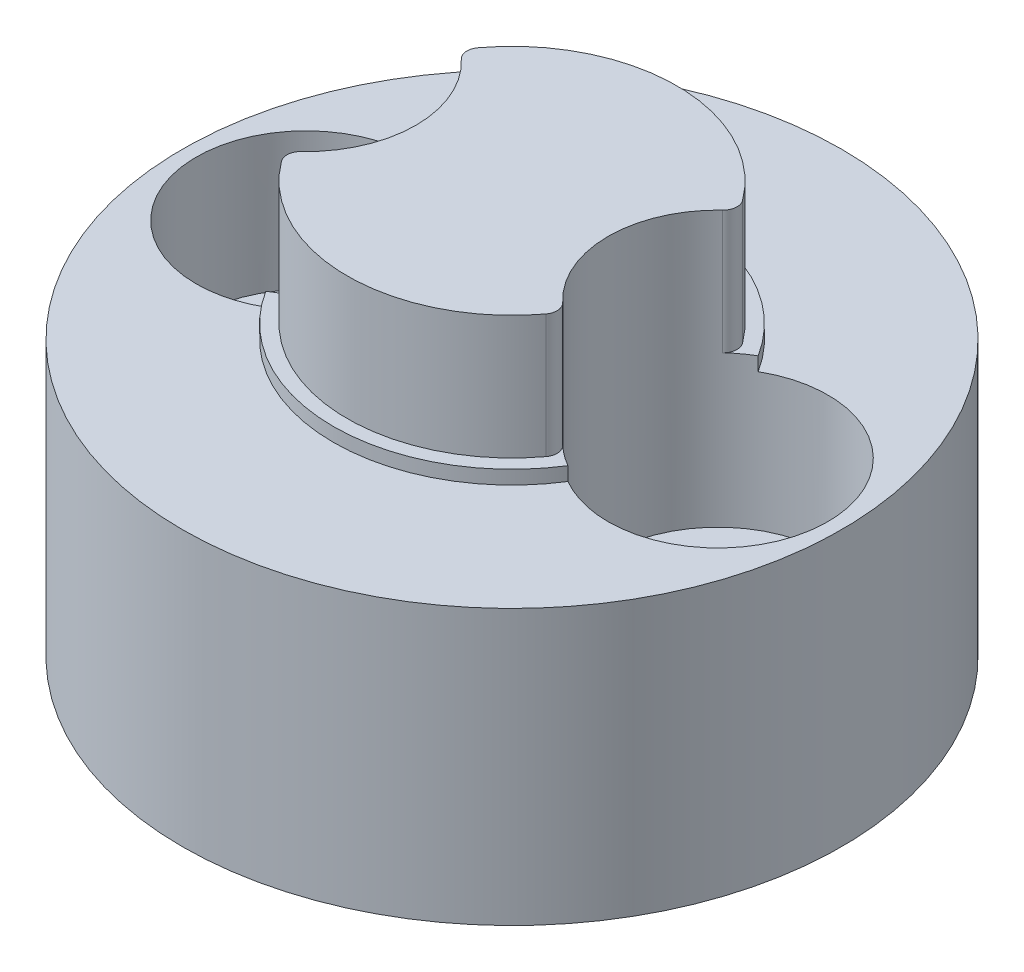
ISO-10303-21;
HEADER;
FILE_DESCRIPTION(('STEP AP214'),'2;1');
FILE_NAME('part.step','',(''),(''),'','','');
FILE_SCHEMA(('AUTOMOTIVE_DESIGN { 1 0 10303 214 1 1 1 1 }'));
ENDSEC;
DATA;
#1=APPLICATION_CONTEXT('core data for automotive mechanical design processes');
#2=APPLICATION_PROTOCOL_DEFINITION('international standard','automotive_design',2000,#1);
#3=PRODUCT_CONTEXT('',#1,'mechanical');
#4=PRODUCT('Part','Part','',(#3));
#5=PRODUCT_RELATED_PRODUCT_CATEGORY('part','',(#4));
#6=PRODUCT_DEFINITION_FORMATION('','',#4);
#7=PRODUCT_DEFINITION_CONTEXT('part definition',#1,'design');
#8=PRODUCT_DEFINITION('design','',#6,#7);
#9=PRODUCT_DEFINITION_SHAPE('','',#8);
#10=(LENGTH_UNIT() NAMED_UNIT(*) SI_UNIT(.MILLI.,.METRE.));
#11=(NAMED_UNIT(*) PLANE_ANGLE_UNIT() SI_UNIT($,.RADIAN.));
#12=(NAMED_UNIT(*) SI_UNIT($,.STERADIAN.) SOLID_ANGLE_UNIT());
#13=UNCERTAINTY_MEASURE_WITH_UNIT(LENGTH_MEASURE(1.E-05),#10,'distance_accuracy_value','');
#14=(GEOMETRIC_REPRESENTATION_CONTEXT(3) GLOBAL_UNCERTAINTY_ASSIGNED_CONTEXT((#13)) GLOBAL_UNIT_ASSIGNED_CONTEXT((#10,
#11,#12)) REPRESENTATION_CONTEXT('',''));
#15=CARTESIAN_POINT('',(0.,0.,0.));
#16=DIRECTION('',(0.,0.,1.));
#17=DIRECTION('',(1.,0.,0.));
#18=AXIS2_PLACEMENT_3D('',#15,#16,#17);
#19=CARTESIAN_POINT('',(-7.5,15.,0.));
#20=DIRECTION('',(0.,-1.,0.));
#21=DIRECTION('',(0.,0.,-1.));
#22=AXIS2_PLACEMENT_3D('',#19,#20,#21);
#23=CYLINDRICAL_SURFACE('',#22,2.15);
#24=CARTESIAN_POINT('',(-7.5,0.,0.));
#25=DIRECTION('',(0.,1.,0.));
#26=DIRECTION('',(0.,0.,1.));
#27=AXIS2_PLACEMENT_3D('',#24,#25,#26);
#28=CIRCLE('',#27,2.15);
#29=CARTESIAN_POINT('',(-7.5,0.,2.15));
#30=VERTEX_POINT('',#29);
#31=EDGE_CURVE('E170',#30,#30,#28,.T.);
#32=ORIENTED_EDGE('',*,*,#31,.F.);
#33=EDGE_LOOP('',(#32));
#34=FACE_BOUND('',#33,.T.);
#35=CARTESIAN_POINT('',(-7.5,5.,0.));
#36=DIRECTION('',(0.,1.,0.));
#37=DIRECTION('',(0.,0.,1.));
#38=AXIS2_PLACEMENT_3D('',#35,#36,#37);
#39=CIRCLE('',#38,2.15);
#40=CARTESIAN_POINT('',(-7.5,5.,2.15));
#41=VERTEX_POINT('',#40);
#42=EDGE_CURVE('E155',#41,#41,#39,.T.);
#43=ORIENTED_EDGE('',*,*,#42,.T.);
#44=EDGE_LOOP('',(#43));
#45=FACE_BOUND('',#44,.T.);
#46=ADVANCED_FACE('F33',(#34,#45),#23,.F.);
#47=CARTESIAN_POINT('',(7.5,15.,0.));
#48=DIRECTION('',(0.,-1.,0.));
#49=DIRECTION('',(0.,0.,-1.));
#50=AXIS2_PLACEMENT_3D('',#47,#48,#49);
#51=CYLINDRICAL_SURFACE('',#50,2.15);
#52=CARTESIAN_POINT('',(7.5,0.,0.));
#53=DIRECTION('',(0.,1.,0.));
#54=DIRECTION('',(0.,0.,-1.));
#55=AXIS2_PLACEMENT_3D('',#52,#53,#54);
#56=CIRCLE('',#55,2.15);
#57=CARTESIAN_POINT('',(7.5,0.,-2.15));
#58=VERTEX_POINT('',#57);
#59=EDGE_CURVE('E167',#58,#58,#56,.T.);
#60=ORIENTED_EDGE('',*,*,#59,.F.);
#61=EDGE_LOOP('',(#60));
#62=FACE_BOUND('',#61,.T.);
#63=CARTESIAN_POINT('',(7.5,5.,0.));
#64=DIRECTION('',(0.,1.,0.));
#65=DIRECTION('',(0.,0.,1.));
#66=AXIS2_PLACEMENT_3D('',#63,#64,#65);
#67=CIRCLE('',#66,2.15);
#68=CARTESIAN_POINT('',(7.5,5.,2.15));
#69=VERTEX_POINT('',#68);
#70=EDGE_CURVE('E180',#69,#69,#67,.T.);
#71=ORIENTED_EDGE('',*,*,#70,.T.);
#72=EDGE_LOOP('',(#71));
#73=FACE_BOUND('',#72,.T.);
#74=ADVANCED_FACE('F290',(#62,#73),#51,.F.);
#75=CARTESIAN_POINT('',(0.,15.,0.));
#76=DIRECTION('',(0.,1.,0.));
#77=DIRECTION('',(0.,0.,1.));
#78=AXIS2_PLACEMENT_3D('',#75,#76,#77);
#79=PLANE('',#78);
#80=CARTESIAN_POINT('',(0.,15.,0.));
#81=DIRECTION('',(0.,1.,0.));
#82=DIRECTION('',(0.,0.,1.));
#83=AXIS2_PLACEMENT_3D('',#80,#81,#82);
#84=CIRCLE('',#83,6.);
#85=CARTESIAN_POINT('',(4.81818181818182,15.,-3.5756291707813));
#86=VERTEX_POINT('',#85);
#87=CARTESIAN_POINT('',(-4.81818181818182,15.,-3.5756291707813));
#88=VERTEX_POINT('',#87);
#89=EDGE_CURVE('E161',#86,#88,#84,.T.);
#90=ORIENTED_EDGE('',*,*,#89,.T.);
#91=CARTESIAN_POINT('',(-4.41666666666667,15.,-3.27766007321619));
#92=DIRECTION('',(0.,1.,0.));
#93=DIRECTION('',(0.,0.,1.));
#94=AXIS2_PLACEMENT_3D('',#91,#92,#93);
#95=CIRCLE('',#94,0.5);
#96=CARTESIAN_POINT('',(-4.75925925925926,15.,-2.91347562063661));
#97=VERTEX_POINT('',#96);
#98=EDGE_CURVE('E200',#88,#97,#95,.T.);
#99=ORIENTED_EDGE('',*,*,#98,.T.);
#100=CARTESIAN_POINT('',(-7.5,15.,0.));
#101=DIRECTION('',(0.,1.,0.));
#102=DIRECTION('',(0.,0.,1.));
#103=AXIS2_PLACEMENT_3D('',#100,#101,#102);
#104=CIRCLE('',#103,4.);
#105=CARTESIAN_POINT('',(-4.75925925925926,15.,2.91347562063661));
#106=VERTEX_POINT('',#105);
#107=EDGE_CURVE('E229',#106,#97,#104,.T.);
#108=ORIENTED_EDGE('',*,*,#107,.F.);
#109=CARTESIAN_POINT('',(-4.41666666666667,15.,3.27766007321619));
#110=DIRECTION('',(0.,1.,0.));
#111=DIRECTION('',(0.,0.,1.));
#112=AXIS2_PLACEMENT_3D('',#109,#110,#111);
#113=CIRCLE('',#112,0.5);
#114=CARTESIAN_POINT('',(-4.81818181818182,15.,3.5756291707813));
#115=VERTEX_POINT('',#114);
#116=EDGE_CURVE('E198',#106,#115,#113,.T.);
#117=ORIENTED_EDGE('',*,*,#116,.T.);
#118=CARTESIAN_POINT('',(0.,15.,0.));
#119=DIRECTION('',(0.,1.,0.));
#120=DIRECTION('',(0.,0.,1.));
#121=AXIS2_PLACEMENT_3D('',#118,#119,#120);
#122=CIRCLE('',#121,6.);
#123=CARTESIAN_POINT('',(4.81818181818182,15.,3.5756291707813));
#124=VERTEX_POINT('',#123);
#125=EDGE_CURVE('E158',#115,#124,#122,.T.);
#126=ORIENTED_EDGE('',*,*,#125,.T.);
#127=CARTESIAN_POINT('',(4.41666666666667,15.,3.27766007321619));
#128=DIRECTION('',(0.,1.,0.));
#129=DIRECTION('',(0.,0.,1.));
#130=AXIS2_PLACEMENT_3D('',#127,#128,#129);
#131=CIRCLE('',#130,0.5);
#132=CARTESIAN_POINT('',(4.75925925925926,15.,2.91347562063661));
#133=VERTEX_POINT('',#132);
#134=EDGE_CURVE('E194',#124,#133,#131,.T.);
#135=ORIENTED_EDGE('',*,*,#134,.T.);
#136=CARTESIAN_POINT('',(7.5,15.,0.));
#137=DIRECTION('',(0.,1.,0.));
#138=DIRECTION('',(0.,0.,1.));
#139=AXIS2_PLACEMENT_3D('',#136,#137,#138);
#140=CIRCLE('',#139,4.);
#141=CARTESIAN_POINT('',(4.75925925925926,15.,-2.91347562063661));
#142=VERTEX_POINT('',#141);
#143=EDGE_CURVE('E240',#142,#133,#140,.T.);
#144=ORIENTED_EDGE('',*,*,#143,.F.);
#145=CARTESIAN_POINT('',(4.41666666666667,15.,-3.27766007321619));
#146=DIRECTION('',(0.,1.,0.));
#147=DIRECTION('',(0.,0.,1.));
#148=AXIS2_PLACEMENT_3D('',#145,#146,#147);
#149=CIRCLE('',#148,0.5);
#150=EDGE_CURVE('E196',#142,#86,#149,.T.);
#151=ORIENTED_EDGE('',*,*,#150,.T.);
#152=EDGE_LOOP('',(#90,#99,#108,#117,#126,#135,#144,#151));
#153=FACE_BOUND('',#152,.T.);
#154=ADVANCED_FACE('F232',(#153),#79,.T.);
#155=CARTESIAN_POINT('',(0.,15.,0.));
#156=DIRECTION('',(0.,-1.,0.));
#157=DIRECTION('',(0.,0.,-1.));
#158=AXIS2_PLACEMENT_3D('',#155,#156,#157);
#159=CYLINDRICAL_SURFACE('',#158,12.);
#160=CARTESIAN_POINT('',(0.,0.,0.));
#161=DIRECTION('',(0.,1.,0.));
#162=DIRECTION('',(0.,0.,1.));
#163=AXIS2_PLACEMENT_3D('',#160,#161,#162);
#164=CIRCLE('',#163,12.);
#165=CARTESIAN_POINT('',(0.,0.,12.));
#166=VERTEX_POINT('',#165);
#167=EDGE_CURVE('E173',#166,#166,#164,.T.);
#168=ORIENTED_EDGE('',*,*,#167,.T.);
#169=EDGE_LOOP('',(#168));
#170=FACE_BOUND('',#169,.T.);
#171=CARTESIAN_POINT('',(0.,10.,0.));
#172=DIRECTION('',(0.,1.,0.));
#173=DIRECTION('',(0.,0.,1.));
#174=AXIS2_PLACEMENT_3D('',#171,#172,#173);
#175=CIRCLE('',#174,12.);
#176=CARTESIAN_POINT('',(0.,10.,12.));
#177=VERTEX_POINT('',#176);
#178=EDGE_CURVE('E164',#177,#177,#175,.T.);
#179=ORIENTED_EDGE('',*,*,#178,.F.);
#180=EDGE_LOOP('',(#179));
#181=FACE_BOUND('',#180,.T.);
#182=ADVANCED_FACE('F303',(#170,#181),#159,.T.);
#183=CARTESIAN_POINT('',(0.,0.,0.));
#184=DIRECTION('',(0.,1.,0.));
#185=DIRECTION('',(0.,0.,1.));
#186=AXIS2_PLACEMENT_3D('',#183,#184,#185);
#187=PLANE('',#186);
#188=ORIENTED_EDGE('',*,*,#167,.F.);
#189=EDGE_LOOP('',(#188));
#190=FACE_BOUND('',#189,.T.);
#191=ORIENTED_EDGE('',*,*,#31,.T.);
#192=EDGE_LOOP('',(#191));
#193=FACE_BOUND('',#192,.T.);
#194=ORIENTED_EDGE('',*,*,#59,.T.);
#195=EDGE_LOOP('',(#194));
#196=FACE_BOUND('',#195,.T.);
#197=ADVANCED_FACE('F304',(#190,#193,#196),#187,.F.);
#198=CARTESIAN_POINT('',(0.,10.,0.));
#199=DIRECTION('',(0.,1.,0.));
#200=DIRECTION('',(0.,0.,1.));
#201=AXIS2_PLACEMENT_3D('',#198,#199,#200);
#202=PLANE('',#201);
#203=CARTESIAN_POINT('',(-7.5,10.,0.));
#204=DIRECTION('',(0.,1.,0.));
#205=DIRECTION('',(0.,0.,1.));
#206=AXIS2_PLACEMENT_3D('',#203,#204,#205);
#207=CIRCLE('',#206,4.);
#208=CARTESIAN_POINT('',(-5.5,10.,-3.46410161513776));
#209=VERTEX_POINT('',#208);
#210=CARTESIAN_POINT('',(-5.5,10.,3.46410161513776));
#211=VERTEX_POINT('',#210);
#212=EDGE_CURVE('E252',#209,#211,#207,.T.);
#213=ORIENTED_EDGE('',*,*,#212,.F.);
#214=CARTESIAN_POINT('',(0.,10.,0.));
#215=DIRECTION('',(0.,1.,0.));
#216=DIRECTION('',(0.,0.,1.));
#217=AXIS2_PLACEMENT_3D('',#214,#215,#216);
#218=CIRCLE('',#217,6.5);
#219=CARTESIAN_POINT('',(5.5,10.,-3.46410161513776));
#220=VERTEX_POINT('',#219);
#221=EDGE_CURVE('E149',#220,#209,#218,.T.);
#222=ORIENTED_EDGE('',*,*,#221,.F.);
#223=CARTESIAN_POINT('',(7.5,10.,0.));
#224=DIRECTION('',(0.,1.,0.));
#225=DIRECTION('',(0.,0.,1.));
#226=AXIS2_PLACEMENT_3D('',#223,#224,#225);
#227=CIRCLE('',#226,4.);
#228=CARTESIAN_POINT('',(5.5,10.,3.46410161513776));
#229=VERTEX_POINT('',#228);
#230=EDGE_CURVE('E124',#229,#220,#227,.T.);
#231=ORIENTED_EDGE('',*,*,#230,.F.);
#232=CARTESIAN_POINT('',(0.,10.,0.));
#233=DIRECTION('',(0.,1.,0.));
#234=DIRECTION('',(0.,0.,1.));
#235=AXIS2_PLACEMENT_3D('',#232,#233,#234);
#236=CIRCLE('',#235,6.5);
#237=EDGE_CURVE('E144',#211,#229,#236,.T.);
#238=ORIENTED_EDGE('',*,*,#237,.F.);
#239=EDGE_LOOP('',(#213,#222,#231,#238));
#240=FACE_BOUND('',#239,.T.);
#241=ORIENTED_EDGE('',*,*,#178,.T.);
#242=EDGE_LOOP('',(#241));
#243=FACE_BOUND('',#242,.T.);
#244=ADVANCED_FACE('F260',(#240,#243),#202,.T.);
#245=CARTESIAN_POINT('',(0.,10.,0.));
#246=DIRECTION('',(0.,1.,0.));
#247=DIRECTION('',(0.,0.,1.));
#248=AXIS2_PLACEMENT_3D('',#245,#246,#247);
#249=CYLINDRICAL_SURFACE('',#248,6.);
#250=CARTESIAN_POINT('',(0.,10.5,0.));
#251=DIRECTION('',(0.,1.,0.));
#252=DIRECTION('',(0.,0.,1.));
#253=AXIS2_PLACEMENT_3D('',#250,#251,#252);
#254=CIRCLE('',#253,6.);
#255=CARTESIAN_POINT('',(-4.81818181818182,10.5,-3.5756291707813));
#256=VERTEX_POINT('',#255);
#257=CARTESIAN_POINT('',(4.81818181818182,10.5,-3.5756291707813));
#258=VERTEX_POINT('',#257);
#259=EDGE_CURVE('E146',#256,#258,#254,.F.);
#260=ORIENTED_EDGE('',*,*,#259,.F.);
#261=DIRECTION('',(0.,1.,0.));
#262=VECTOR('',#261,1.);
#263=CARTESIAN_POINT('',(-4.81818181818182,10.,-3.5756291707813));
#264=LINE('',#263,#262);
#265=EDGE_CURVE('E192',#256,#88,#264,.T.);
#266=ORIENTED_EDGE('',*,*,#265,.T.);
#267=ORIENTED_EDGE('',*,*,#89,.F.);
#268=DIRECTION('',(0.,1.,0.));
#269=VECTOR('',#268,1.);
#270=CARTESIAN_POINT('',(4.81818181818182,10.,-3.5756291707813));
#271=LINE('',#270,#269);
#272=EDGE_CURVE('E190',#86,#258,#271,.F.);
#273=ORIENTED_EDGE('',*,*,#272,.T.);
#274=EDGE_LOOP('',(#260,#266,#267,#273));
#275=FACE_BOUND('',#274,.T.);
#276=ADVANCED_FACE('F269',(#275),#249,.T.);
#277=CARTESIAN_POINT('',(0.,10.,0.));
#278=DIRECTION('',(0.,1.,0.));
#279=DIRECTION('',(0.,0.,1.));
#280=AXIS2_PLACEMENT_3D('',#277,#278,#279);
#281=CYLINDRICAL_SURFACE('',#280,6.);
#282=ORIENTED_EDGE('',*,*,#125,.F.);
#283=DIRECTION('',(0.,1.,0.));
#284=VECTOR('',#283,1.);
#285=CARTESIAN_POINT('',(-4.81818181818182,10.,3.5756291707813));
#286=LINE('',#285,#284);
#287=CARTESIAN_POINT('',(-4.81818181818182,10.5,3.5756291707813));
#288=VERTEX_POINT('',#287);
#289=EDGE_CURVE('E204',#115,#288,#286,.F.);
#290=ORIENTED_EDGE('',*,*,#289,.T.);
#291=CARTESIAN_POINT('',(0.,10.5,0.));
#292=DIRECTION('',(0.,1.,0.));
#293=DIRECTION('',(0.,0.,1.));
#294=AXIS2_PLACEMENT_3D('',#291,#292,#293);
#295=CIRCLE('',#294,6.);
#296=CARTESIAN_POINT('',(4.81818181818182,10.5,3.5756291707813));
#297=VERTEX_POINT('',#296);
#298=EDGE_CURVE('E130',#297,#288,#295,.F.);
#299=ORIENTED_EDGE('',*,*,#298,.F.);
#300=DIRECTION('',(0.,1.,0.));
#301=VECTOR('',#300,1.);
#302=CARTESIAN_POINT('',(4.81818181818182,10.,3.5756291707813));
#303=LINE('',#302,#301);
#304=EDGE_CURVE('E202',#297,#124,#303,.T.);
#305=ORIENTED_EDGE('',*,*,#304,.T.);
#306=EDGE_LOOP('',(#282,#290,#299,#305));
#307=FACE_BOUND('',#306,.T.);
#308=ADVANCED_FACE('F279',(#307),#281,.T.);
#309=CARTESIAN_POINT('',(3.75,10.5,0.));
#310=DIRECTION('',(0.,1.,0.));
#311=DIRECTION('',(0.,0.,1.));
#312=AXIS2_PLACEMENT_3D('',#309,#310,#311);
#313=PLANE('',#312);
#314=CARTESIAN_POINT('',(-7.5,10.5,0.));
#315=DIRECTION('',(0.,1.,0.));
#316=DIRECTION('',(0.,0.,1.));
#317=AXIS2_PLACEMENT_3D('',#314,#315,#316);
#318=CIRCLE('',#317,4.);
#319=CARTESIAN_POINT('',(-5.5,10.5,3.46410161513776));
#320=VERTEX_POINT('',#319);
#321=CARTESIAN_POINT('',(-4.75925925925926,10.5,2.91347562063661));
#322=VERTEX_POINT('',#321);
#323=EDGE_CURVE('E152',#320,#322,#318,.T.);
#324=ORIENTED_EDGE('',*,*,#323,.F.);
#325=CARTESIAN_POINT('',(0.,10.5,0.));
#326=DIRECTION('',(0.,1.,0.));
#327=DIRECTION('',(0.,0.,1.));
#328=AXIS2_PLACEMENT_3D('',#325,#326,#327);
#329=CIRCLE('',#328,6.5);
#330=CARTESIAN_POINT('',(5.5,10.5,3.46410161513776));
#331=VERTEX_POINT('',#330);
#332=EDGE_CURVE('E143',#320,#331,#329,.T.);
#333=ORIENTED_EDGE('',*,*,#332,.T.);
#334=CARTESIAN_POINT('',(7.5,10.5,0.));
#335=DIRECTION('',(0.,1.,0.));
#336=DIRECTION('',(0.,0.,1.));
#337=AXIS2_PLACEMENT_3D('',#334,#335,#336);
#338=CIRCLE('',#337,4.);
#339=CARTESIAN_POINT('',(4.75925925925926,10.5,2.91347562063661));
#340=VERTEX_POINT('',#339);
#341=EDGE_CURVE('E55',#340,#331,#338,.T.);
#342=ORIENTED_EDGE('',*,*,#341,.F.);
#343=CARTESIAN_POINT('',(4.41666666666667,10.5,3.27766007321619));
#344=DIRECTION('',(0.,1.,0.));
#345=DIRECTION('',(0.,0.,1.));
#346=AXIS2_PLACEMENT_3D('',#343,#344,#345);
#347=CIRCLE('',#346,0.5);
#348=EDGE_CURVE('E11',#340,#297,#347,.F.);
#349=ORIENTED_EDGE('',*,*,#348,.T.);
#350=ORIENTED_EDGE('',*,*,#298,.T.);
#351=CARTESIAN_POINT('',(-4.41666666666667,10.5,3.27766007321619));
#352=DIRECTION('',(0.,1.,0.));
#353=DIRECTION('',(0.,0.,1.));
#354=AXIS2_PLACEMENT_3D('',#351,#352,#353);
#355=CIRCLE('',#354,0.5);
#356=EDGE_CURVE('E213',#288,#322,#355,.F.);
#357=ORIENTED_EDGE('',*,*,#356,.T.);
#358=EDGE_LOOP('',(#324,#333,#342,#349,#350,#357));
#359=FACE_BOUND('',#358,.T.);
#360=ADVANCED_FACE('F218',(#359),#313,.T.);
#361=CARTESIAN_POINT('',(0.,10.5,0.));
#362=DIRECTION('',(0.,-1.,0.));
#363=DIRECTION('',(0.,0.,-1.));
#364=AXIS2_PLACEMENT_3D('',#361,#362,#363);
#365=CYLINDRICAL_SURFACE('',#364,6.5);
#366=ORIENTED_EDGE('',*,*,#332,.F.);
#367=DIRECTION('',(0.,1.,0.));
#368=VECTOR('',#367,1.);
#369=CARTESIAN_POINT('',(-5.5,10.,3.46410161513776));
#370=LINE('',#369,#368);
#371=EDGE_CURVE('E253',#320,#211,#370,.F.);
#372=ORIENTED_EDGE('',*,*,#371,.T.);
#373=ORIENTED_EDGE('',*,*,#237,.T.);
#374=DIRECTION('',(0.,1.,0.));
#375=VECTOR('',#374,1.);
#376=CARTESIAN_POINT('',(5.5,10.,3.46410161513776));
#377=LINE('',#376,#375);
#378=EDGE_CURVE('E246',#229,#331,#377,.T.);
#379=ORIENTED_EDGE('',*,*,#378,.T.);
#380=EDGE_LOOP('',(#366,#372,#373,#379));
#381=FACE_BOUND('',#380,.T.);
#382=ADVANCED_FACE('F257',(#381),#365,.T.);
#383=CARTESIAN_POINT('',(-7.5,10.5,0.));
#384=DIRECTION('',(0.,1.,0.));
#385=DIRECTION('',(0.,0.,1.));
#386=AXIS2_PLACEMENT_3D('',#383,#384,#385);
#387=CIRCLE('',#386,4.);
#388=CARTESIAN_POINT('',(-4.75925925925926,10.5,-2.91347562063661));
#389=VERTEX_POINT('',#388);
#390=CARTESIAN_POINT('',(-5.5,10.5,-3.46410161513776));
#391=VERTEX_POINT('',#390);
#392=EDGE_CURVE('E250',#389,#391,#387,.T.);
#393=ORIENTED_EDGE('',*,*,#392,.F.);
#394=CARTESIAN_POINT('',(-4.41666666666667,10.5,-3.27766007321619));
#395=DIRECTION('',(0.,1.,0.));
#396=DIRECTION('',(0.,0.,1.));
#397=AXIS2_PLACEMENT_3D('',#394,#395,#396);
#398=CIRCLE('',#397,0.5);
#399=EDGE_CURVE('E211',#389,#256,#398,.F.);
#400=ORIENTED_EDGE('',*,*,#399,.T.);
#401=ORIENTED_EDGE('',*,*,#259,.T.);
#402=CARTESIAN_POINT('',(4.41666666666667,10.5,-3.27766007321619));
#403=DIRECTION('',(0.,1.,0.));
#404=DIRECTION('',(0.,0.,1.));
#405=AXIS2_PLACEMENT_3D('',#402,#403,#404);
#406=CIRCLE('',#405,0.5);
#407=CARTESIAN_POINT('',(4.75925925925926,10.5,-2.91347562063661));
#408=VERTEX_POINT('',#407);
#409=EDGE_CURVE('E41',#258,#408,#406,.F.);
#410=ORIENTED_EDGE('',*,*,#409,.T.);
#411=CARTESIAN_POINT('',(7.5,10.5,0.));
#412=DIRECTION('',(0.,1.,0.));
#413=DIRECTION('',(0.,0.,1.));
#414=AXIS2_PLACEMENT_3D('',#411,#412,#413);
#415=CIRCLE('',#414,4.);
#416=CARTESIAN_POINT('',(5.5,10.5,-3.46410161513776));
#417=VERTEX_POINT('',#416);
#418=EDGE_CURVE('E48',#417,#408,#415,.T.);
#419=ORIENTED_EDGE('',*,*,#418,.F.);
#420=CARTESIAN_POINT('',(0.,10.5,0.));
#421=DIRECTION('',(0.,1.,0.));
#422=DIRECTION('',(0.,0.,1.));
#423=AXIS2_PLACEMENT_3D('',#420,#421,#422);
#424=CIRCLE('',#423,6.5);
#425=EDGE_CURVE('E135',#417,#391,#424,.T.);
#426=ORIENTED_EDGE('',*,*,#425,.T.);
#427=EDGE_LOOP('',(#393,#400,#401,#410,#419,#426));
#428=FACE_BOUND('',#427,.T.);
#429=ADVANCED_FACE('F134',(#428),#313,.T.);
#430=CARTESIAN_POINT('',(0.,10.5,0.));
#431=DIRECTION('',(0.,-1.,0.));
#432=DIRECTION('',(0.,0.,-1.));
#433=AXIS2_PLACEMENT_3D('',#430,#431,#432);
#434=CYLINDRICAL_SURFACE('',#433,6.5);
#435=ORIENTED_EDGE('',*,*,#221,.T.);
#436=DIRECTION('',(0.,1.,0.));
#437=VECTOR('',#436,1.);
#438=CARTESIAN_POINT('',(-5.5,10.,-3.46410161513776));
#439=LINE('',#438,#437);
#440=EDGE_CURVE('E129',#209,#391,#439,.T.);
#441=ORIENTED_EDGE('',*,*,#440,.T.);
#442=ORIENTED_EDGE('',*,*,#425,.F.);
#443=DIRECTION('',(0.,1.,0.));
#444=VECTOR('',#443,1.);
#445=CARTESIAN_POINT('',(5.5,10.,-3.46410161513776));
#446=LINE('',#445,#444);
#447=EDGE_CURVE('E120',#417,#220,#446,.F.);
#448=ORIENTED_EDGE('',*,*,#447,.T.);
#449=EDGE_LOOP('',(#435,#441,#442,#448));
#450=FACE_BOUND('',#449,.T.);
#451=ADVANCED_FACE('F142',(#450),#434,.T.);
#452=CARTESIAN_POINT('',(7.5,5.,0.));
#453=DIRECTION('',(0.,1.,0.));
#454=DIRECTION('',(0.,0.,1.));
#455=AXIS2_PLACEMENT_3D('',#452,#453,#454);
#456=CYLINDRICAL_SURFACE('',#455,4.);
#457=ORIENTED_EDGE('',*,*,#418,.T.);
#458=DIRECTION('',(0.,1.,0.));
#459=VECTOR('',#458,1.);
#460=CARTESIAN_POINT('',(4.75925925925926,5.,-2.91347562063662));
#461=LINE('',#460,#459);
#462=EDGE_CURVE('E209',#408,#142,#461,.T.);
#463=ORIENTED_EDGE('',*,*,#462,.T.);
#464=ORIENTED_EDGE('',*,*,#143,.T.);
#465=DIRECTION('',(0.,1.,0.));
#466=VECTOR('',#465,1.);
#467=CARTESIAN_POINT('',(4.75925925925926,5.,2.91347562063662));
#468=LINE('',#467,#466);
#469=EDGE_CURVE('E206',#133,#340,#468,.F.);
#470=ORIENTED_EDGE('',*,*,#469,.T.);
#471=ORIENTED_EDGE('',*,*,#341,.T.);
#472=ORIENTED_EDGE('',*,*,#378,.F.);
#473=ORIENTED_EDGE('',*,*,#230,.T.);
#474=ORIENTED_EDGE('',*,*,#447,.F.);
#475=EDGE_LOOP('',(#457,#463,#464,#470,#471,#472,#473,#474));
#476=FACE_BOUND('',#475,.T.);
#477=CARTESIAN_POINT('',(7.5,5.,0.));
#478=DIRECTION('',(0.,1.,0.));
#479=DIRECTION('',(0.,0.,1.));
#480=AXIS2_PLACEMENT_3D('',#477,#478,#479);
#481=CIRCLE('',#480,4.);
#482=CARTESIAN_POINT('',(7.5,5.,4.));
#483=VERTEX_POINT('',#482);
#484=EDGE_CURVE('E235',#483,#483,#481,.T.);
#485=ORIENTED_EDGE('',*,*,#484,.F.);
#486=EDGE_LOOP('',(#485));
#487=FACE_BOUND('',#486,.T.);
#488=ADVANCED_FACE('F121',(#476,#487),#456,.F.);
#489=CARTESIAN_POINT('',(7.5,5.,0.));
#490=DIRECTION('',(0.,1.,0.));
#491=DIRECTION('',(0.,0.,1.));
#492=AXIS2_PLACEMENT_3D('',#489,#490,#491);
#493=PLANE('',#492);
#494=ORIENTED_EDGE('',*,*,#70,.F.);
#495=EDGE_LOOP('',(#494));
#496=FACE_BOUND('',#495,.T.);
#497=ORIENTED_EDGE('',*,*,#484,.T.);
#498=EDGE_LOOP('',(#497));
#499=FACE_BOUND('',#498,.T.);
#500=ADVANCED_FACE('F347',(#496,#499),#493,.T.);
#501=CARTESIAN_POINT('',(-7.5,5.,0.));
#502=DIRECTION('',(0.,1.,0.));
#503=DIRECTION('',(0.,0.,1.));
#504=AXIS2_PLACEMENT_3D('',#501,#502,#503);
#505=CYLINDRICAL_SURFACE('',#504,4.);
#506=ORIENTED_EDGE('',*,*,#107,.T.);
#507=DIRECTION('',(0.,1.,0.));
#508=VECTOR('',#507,1.);
#509=CARTESIAN_POINT('',(-4.75925925925926,5.,-2.91347562063661));
#510=LINE('',#509,#508);
#511=EDGE_CURVE('E187',#97,#389,#510,.F.);
#512=ORIENTED_EDGE('',*,*,#511,.T.);
#513=ORIENTED_EDGE('',*,*,#392,.T.);
#514=ORIENTED_EDGE('',*,*,#440,.F.);
#515=ORIENTED_EDGE('',*,*,#212,.T.);
#516=ORIENTED_EDGE('',*,*,#371,.F.);
#517=ORIENTED_EDGE('',*,*,#323,.T.);
#518=DIRECTION('',(0.,1.,0.));
#519=VECTOR('',#518,1.);
#520=CARTESIAN_POINT('',(-4.75925925925926,5.,2.91347562063661));
#521=LINE('',#520,#519);
#522=EDGE_CURVE('E179',#322,#106,#521,.T.);
#523=ORIENTED_EDGE('',*,*,#522,.T.);
#524=EDGE_LOOP('',(#506,#512,#513,#514,#515,#516,#517,#523));
#525=FACE_BOUND('',#524,.T.);
#526=CARTESIAN_POINT('',(-7.5,5.,0.));
#527=DIRECTION('',(0.,1.,0.));
#528=DIRECTION('',(0.,0.,1.));
#529=AXIS2_PLACEMENT_3D('',#526,#527,#528);
#530=CIRCLE('',#529,4.);
#531=CARTESIAN_POINT('',(-7.5,5.,4.));
#532=VERTEX_POINT('',#531);
#533=EDGE_CURVE('E139',#532,#532,#530,.T.);
#534=ORIENTED_EDGE('',*,*,#533,.F.);
#535=EDGE_LOOP('',(#534));
#536=FACE_BOUND('',#535,.T.);
#537=ADVANCED_FACE('F227',(#525,#536),#505,.F.);
#538=CARTESIAN_POINT('',(-7.5,5.,0.));
#539=DIRECTION('',(0.,1.,0.));
#540=DIRECTION('',(0.,0.,1.));
#541=AXIS2_PLACEMENT_3D('',#538,#539,#540);
#542=PLANE('',#541);
#543=ORIENTED_EDGE('',*,*,#42,.F.);
#544=EDGE_LOOP('',(#543));
#545=FACE_BOUND('',#544,.T.);
#546=ORIENTED_EDGE('',*,*,#533,.T.);
#547=EDGE_LOOP('',(#546));
#548=FACE_BOUND('',#547,.T.);
#549=ADVANCED_FACE('F313',(#545,#548),#542,.T.);
#550=CARTESIAN_POINT('',(-4.41666666666667,10.,-3.27766007321619));
#551=DIRECTION('',(0.,1.,0.));
#552=DIRECTION('',(0.,0.,1.));
#553=AXIS2_PLACEMENT_3D('',#550,#551,#552);
#554=CYLINDRICAL_SURFACE('',#553,0.5);
#555=ORIENTED_EDGE('',*,*,#98,.F.);
#556=ORIENTED_EDGE('',*,*,#265,.F.);
#557=ORIENTED_EDGE('',*,*,#399,.F.);
#558=ORIENTED_EDGE('',*,*,#511,.F.);
#559=EDGE_LOOP('',(#555,#556,#557,#558));
#560=FACE_BOUND('',#559,.T.);
#561=ADVANCED_FACE('F266',(#560),#554,.T.);
#562=CARTESIAN_POINT('',(-4.41666666666667,10.,3.27766007321619));
#563=DIRECTION('',(0.,-1.,0.));
#564=DIRECTION('',(0.,0.,-1.));
#565=AXIS2_PLACEMENT_3D('',#562,#563,#564);
#566=CYLINDRICAL_SURFACE('',#565,0.5);
#567=ORIENTED_EDGE('',*,*,#356,.F.);
#568=ORIENTED_EDGE('',*,*,#289,.F.);
#569=ORIENTED_EDGE('',*,*,#116,.F.);
#570=ORIENTED_EDGE('',*,*,#522,.F.);
#571=EDGE_LOOP('',(#567,#568,#569,#570));
#572=FACE_BOUND('',#571,.T.);
#573=ADVANCED_FACE('F223',(#572),#566,.T.);
#574=CARTESIAN_POINT('',(4.41666666666667,10.,-3.27766007321619));
#575=DIRECTION('',(0.,-1.,0.));
#576=DIRECTION('',(0.,0.,-1.));
#577=AXIS2_PLACEMENT_3D('',#574,#575,#576);
#578=CYLINDRICAL_SURFACE('',#577,0.5);
#579=ORIENTED_EDGE('',*,*,#409,.F.);
#580=ORIENTED_EDGE('',*,*,#272,.F.);
#581=ORIENTED_EDGE('',*,*,#150,.F.);
#582=ORIENTED_EDGE('',*,*,#462,.F.);
#583=EDGE_LOOP('',(#579,#580,#581,#582));
#584=FACE_BOUND('',#583,.T.);
#585=ADVANCED_FACE('F273',(#584),#578,.T.);
#586=CARTESIAN_POINT('',(4.41666666666667,10.,3.27766007321619));
#587=DIRECTION('',(0.,1.,0.));
#588=DIRECTION('',(0.,0.,1.));
#589=AXIS2_PLACEMENT_3D('',#586,#587,#588);
#590=CYLINDRICAL_SURFACE('',#589,0.5);
#591=ORIENTED_EDGE('',*,*,#134,.F.);
#592=ORIENTED_EDGE('',*,*,#304,.F.);
#593=ORIENTED_EDGE('',*,*,#348,.F.);
#594=ORIENTED_EDGE('',*,*,#469,.F.);
#595=EDGE_LOOP('',(#591,#592,#593,#594));
#596=FACE_BOUND('',#595,.T.);
#597=ADVANCED_FACE('F35',(#596),#590,.T.);
#598=CLOSED_SHELL('',(#46,#74,#154,#182,#197,#244,#276,#308,#360,#382,#429,#451,#488,#500,#537,
#549,#561,#573,#585,#597));
#599=MANIFOLD_SOLID_BREP('B2',#598);
#600=ADVANCED_BREP_SHAPE_REPRESENTATION('',(#18,#599),#14);
#601=SHAPE_DEFINITION_REPRESENTATION(#9,#600);
ENDSEC;
END-ISO-10303-21;
